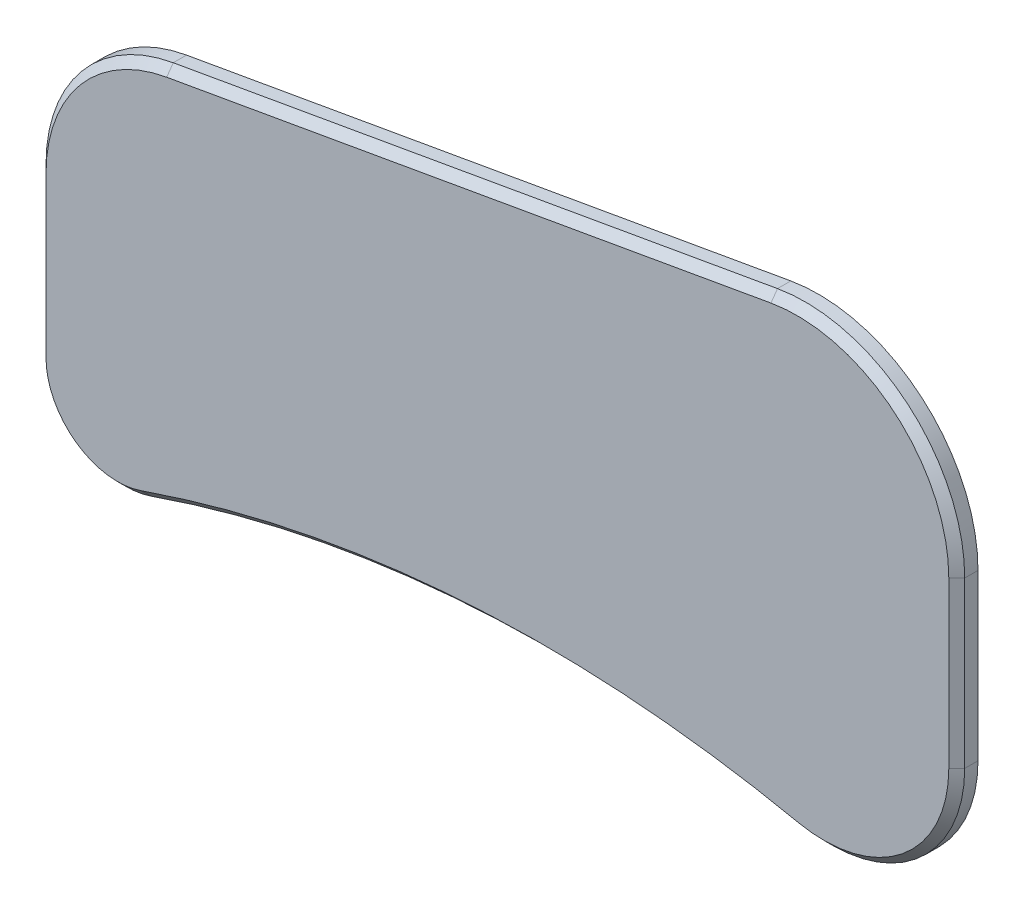
ISO-10303-21;
HEADER;
FILE_DESCRIPTION(('STEP AP214'),'2;1');
FILE_NAME('part.step','',(''),(''),'','','');
FILE_SCHEMA(('AUTOMOTIVE_DESIGN { 1 0 10303 214 1 1 1 1 }'));
ENDSEC;
DATA;
#1=APPLICATION_CONTEXT('core data for automotive mechanical design processes');
#2=APPLICATION_PROTOCOL_DEFINITION('international standard','automotive_design',2000,#1);
#3=PRODUCT_CONTEXT('',#1,'mechanical');
#4=PRODUCT('Part','Part','',(#3));
#5=PRODUCT_RELATED_PRODUCT_CATEGORY('part','',(#4));
#6=PRODUCT_DEFINITION_FORMATION('','',#4);
#7=PRODUCT_DEFINITION_CONTEXT('part definition',#1,'design');
#8=PRODUCT_DEFINITION('design','',#6,#7);
#9=PRODUCT_DEFINITION_SHAPE('','',#8);
#10=(LENGTH_UNIT() NAMED_UNIT(*) SI_UNIT(.MILLI.,.METRE.));
#11=(NAMED_UNIT(*) PLANE_ANGLE_UNIT() SI_UNIT($,.RADIAN.));
#12=(NAMED_UNIT(*) SI_UNIT($,.STERADIAN.) SOLID_ANGLE_UNIT());
#13=UNCERTAINTY_MEASURE_WITH_UNIT(LENGTH_MEASURE(1.E-05),#10,'distance_accuracy_value','');
#14=(GEOMETRIC_REPRESENTATION_CONTEXT(3) GLOBAL_UNCERTAINTY_ASSIGNED_CONTEXT((#13)) GLOBAL_UNIT_ASSIGNED_CONTEXT((#10,
#11,#12)) REPRESENTATION_CONTEXT('',''));
#15=CARTESIAN_POINT('',(0.,0.,0.));
#16=DIRECTION('',(0.,0.,1.));
#17=DIRECTION('',(1.,0.,0.));
#18=AXIS2_PLACEMENT_3D('',#15,#16,#17);
#19=CARTESIAN_POINT('',(59.9643086686465,10.5216569582568,4.));
#20=DIRECTION('',(0.,0.,-1.));
#21=DIRECTION('',(-1.,0.,0.));
#22=AXIS2_PLACEMENT_3D('',#19,#20,#21);
#23=CYLINDRICAL_SURFACE('',#22,30.0356913313535);
#24=DIRECTION('',(0.,0.,-1.));
#25=VECTOR('',#24,1.);
#26=CARTESIAN_POINT('',(54.7486656039907,40.1010386484553,4.));
#27=LINE('',#26,#25);
#28=CARTESIAN_POINT('',(54.7486656039907,40.1010386484553,2.49999999999997));
#29=VERTEX_POINT('',#28);
#30=CARTESIAN_POINT('',(54.7486656039907,40.1010386484553,0.));
#31=VERTEX_POINT('',#30);
#32=EDGE_CURVE('E124',#29,#31,#27,.T.);
#33=ORIENTED_EDGE('',*,*,#32,.F.);
#34=CARTESIAN_POINT('',(59.9643086686465,10.5216569582568,2.49999999999997));
#35=DIRECTION('',(0.,0.,1.));
#36=DIRECTION('',(1.,0.,0.));
#37=AXIS2_PLACEMENT_3D('',#34,#35,#36);
#38=CIRCLE('',#37,30.0356913313535);
#39=CARTESIAN_POINT('',(90.,10.5216569582568,2.49999999999997));
#40=VERTEX_POINT('',#39);
#41=EDGE_CURVE('E213',#29,#40,#38,.F.);
#42=ORIENTED_EDGE('',*,*,#41,.T.);
#43=DIRECTION('',(0.,0.,-1.));
#44=VECTOR('',#43,1.);
#45=CARTESIAN_POINT('',(90.,10.5216569582568,4.));
#46=LINE('',#45,#44);
#47=CARTESIAN_POINT('',(90.,10.5216569582568,0.));
#48=VERTEX_POINT('',#47);
#49=EDGE_CURVE('E146',#40,#48,#46,.T.);
#50=ORIENTED_EDGE('',*,*,#49,.T.);
#51=CARTESIAN_POINT('',(59.9643086686465,10.5216569582568,0.));
#52=DIRECTION('',(0.,0.,1.));
#53=DIRECTION('',(1.,0.,0.));
#54=AXIS2_PLACEMENT_3D('',#51,#52,#53);
#55=CIRCLE('',#54,30.0356913313535);
#56=EDGE_CURVE('E139',#48,#31,#55,.T.);
#57=ORIENTED_EDGE('',*,*,#56,.T.);
#58=EDGE_LOOP('',(#33,#42,#50,#57));
#59=FACE_BOUND('',#58,.T.);
#60=ADVANCED_FACE('F36',(#59),#23,.T.);
#61=CARTESIAN_POINT('',(54.7486656039907,40.1010386484553,4.));
#62=DIRECTION('',(0.173648177666925,-0.984807753012209,0.));
#63=DIRECTION('',(0.984807753012209,0.173648177666925,0.));
#64=AXIS2_PLACEMENT_3D('',#61,#62,#63);
#65=PLANE('',#64);
#66=DIRECTION('',(0.,0.,-1.));
#67=VECTOR('',#66,1.);
#68=CARTESIAN_POINT('',(-59.0357971523408,20.0377678790973,4.));
#69=LINE('',#68,#67);
#70=CARTESIAN_POINT('',(-59.0357971523408,20.0377678790973,2.49999999999997));
#71=VERTEX_POINT('',#70);
#72=CARTESIAN_POINT('',(-59.0357971523408,20.0377678790973,0.));
#73=VERTEX_POINT('',#72);
#74=EDGE_CURVE('E133',#71,#73,#69,.T.);
#75=ORIENTED_EDGE('',*,*,#74,.F.);
#76=DIRECTION('',(0.984807753012209,0.173648177666925,0.));
#77=VECTOR('',#76,1.);
#78=CARTESIAN_POINT('',(54.7486656039907,40.1010386484553,2.49999999999997));
#79=LINE('',#78,#77);
#80=EDGE_CURVE('E11',#71,#29,#79,.T.);
#81=ORIENTED_EDGE('',*,*,#80,.T.);
#82=ORIENTED_EDGE('',*,*,#32,.T.);
#83=DIRECTION('',(-0.984807753012209,-0.173648177666925,0.));
#84=VECTOR('',#83,1.);
#85=CARTESIAN_POINT('',(54.7486656039907,40.1010386484553,0.));
#86=LINE('',#85,#84);
#87=EDGE_CURVE('E127',#31,#73,#86,.T.);
#88=ORIENTED_EDGE('',*,*,#87,.T.);
#89=EDGE_LOOP('',(#75,#81,#82,#88));
#90=FACE_BOUND('',#89,.T.);
#91=ADVANCED_FACE('F126',(#90),#65,.F.);
#92=CARTESIAN_POINT('',(-54.,-8.52165695825679,4.));
#93=DIRECTION('',(0.,0.,-1.));
#94=DIRECTION('',(-1.,0.,0.));
#95=AXIS2_PLACEMENT_3D('',#92,#93,#94);
#96=CYLINDRICAL_SURFACE('',#95,29.);
#97=DIRECTION('',(0.,0.,-1.));
#98=VECTOR('',#97,1.);
#99=CARTESIAN_POINT('',(-83.,-8.52165695825678,4.));
#100=LINE('',#99,#98);
#101=CARTESIAN_POINT('',(-83.,-8.52165695825678,2.49999999999997));
#102=VERTEX_POINT('',#101);
#103=CARTESIAN_POINT('',(-83.,-8.52165695825678,0.));
#104=VERTEX_POINT('',#103);
#105=EDGE_CURVE('E180',#102,#104,#100,.T.);
#106=ORIENTED_EDGE('',*,*,#105,.F.);
#107=CARTESIAN_POINT('',(-54.,-8.52165695825679,2.49999999999997));
#108=DIRECTION('',(0.,0.,1.));
#109=DIRECTION('',(1.,0.,0.));
#110=AXIS2_PLACEMENT_3D('',#107,#108,#109);
#111=CIRCLE('',#110,29.);
#112=EDGE_CURVE('E46',#102,#71,#111,.F.);
#113=ORIENTED_EDGE('',*,*,#112,.T.);
#114=ORIENTED_EDGE('',*,*,#74,.T.);
#115=CARTESIAN_POINT('',(-54.,-8.52165695825679,0.));
#116=DIRECTION('',(0.,0.,1.));
#117=DIRECTION('',(1.,0.,0.));
#118=AXIS2_PLACEMENT_3D('',#115,#116,#117);
#119=CIRCLE('',#118,29.);
#120=EDGE_CURVE('E142',#73,#104,#119,.T.);
#121=ORIENTED_EDGE('',*,*,#120,.T.);
#122=EDGE_LOOP('',(#106,#113,#114,#121));
#123=FACE_BOUND('',#122,.T.);
#124=ADVANCED_FACE('F296',(#123),#96,.T.);
#125=CARTESIAN_POINT('',(-83.,-8.52165695825678,4.));
#126=DIRECTION('',(1.,0.,0.));
#127=DIRECTION('',(0.,0.,-1.));
#128=AXIS2_PLACEMENT_3D('',#125,#126,#127);
#129=PLANE('',#128);
#130=DIRECTION('',(0.,0.,-1.));
#131=VECTOR('',#130,1.);
#132=CARTESIAN_POINT('',(-83.,-38.5216569582568,4.));
#133=LINE('',#132,#131);
#134=CARTESIAN_POINT('',(-83.,-38.5216569582568,2.49999999999997));
#135=VERTEX_POINT('',#134);
#136=CARTESIAN_POINT('',(-83.,-38.5216569582568,0.));
#137=VERTEX_POINT('',#136);
#138=EDGE_CURVE('E178',#135,#137,#133,.T.);
#139=ORIENTED_EDGE('',*,*,#138,.F.);
#140=DIRECTION('',(0.,1.,0.));
#141=VECTOR('',#140,1.);
#142=CARTESIAN_POINT('',(-83.,-8.52165695825678,2.49999999999997));
#143=LINE('',#142,#141);
#144=EDGE_CURVE('E211',#135,#102,#143,.T.);
#145=ORIENTED_EDGE('',*,*,#144,.T.);
#146=ORIENTED_EDGE('',*,*,#105,.T.);
#147=DIRECTION('',(0.,-1.,0.));
#148=VECTOR('',#147,1.);
#149=CARTESIAN_POINT('',(-83.,-8.52165695825678,0.));
#150=LINE('',#149,#148);
#151=EDGE_CURVE('E156',#104,#137,#150,.T.);
#152=ORIENTED_EDGE('',*,*,#151,.T.);
#153=EDGE_LOOP('',(#139,#145,#146,#152));
#154=FACE_BOUND('',#153,.T.);
#155=ADVANCED_FACE('F278',(#154),#129,.F.);
#156=CARTESIAN_POINT('',(-68.,-38.5216569582568,4.));
#157=DIRECTION('',(0.,0.,-1.));
#158=DIRECTION('',(-1.,0.,0.));
#159=AXIS2_PLACEMENT_3D('',#156,#157,#158);
#160=CYLINDRICAL_SURFACE('',#159,15.);
#161=DIRECTION('',(0.,0.,-1.));
#162=VECTOR('',#161,1.);
#163=CARTESIAN_POINT('',(-63.0867497743949,-52.6941645776088,4.));
#164=LINE('',#163,#162);
#165=CARTESIAN_POINT('',(-63.0867497743949,-52.6941645776088,2.49999999999997));
#166=VERTEX_POINT('',#165);
#167=CARTESIAN_POINT('',(-63.0867497743949,-52.6941645776088,0.));
#168=VERTEX_POINT('',#167);
#169=EDGE_CURVE('E176',#166,#168,#164,.T.);
#170=ORIENTED_EDGE('',*,*,#169,.F.);
#171=CARTESIAN_POINT('',(-68.,-38.5216569582568,2.49999999999997));
#172=DIRECTION('',(0.,0.,1.));
#173=DIRECTION('',(1.,0.,0.));
#174=AXIS2_PLACEMENT_3D('',#171,#172,#173);
#175=CIRCLE('',#174,15.);
#176=EDGE_CURVE('E207',#166,#135,#175,.F.);
#177=ORIENTED_EDGE('',*,*,#176,.T.);
#178=ORIENTED_EDGE('',*,*,#138,.T.);
#179=CARTESIAN_POINT('',(-68.,-38.5216569582568,0.));
#180=DIRECTION('',(0.,0.,1.));
#181=DIRECTION('',(1.,0.,0.));
#182=AXIS2_PLACEMENT_3D('',#179,#180,#181);
#183=CIRCLE('',#182,15.);
#184=EDGE_CURVE('E159',#137,#168,#183,.T.);
#185=ORIENTED_EDGE('',*,*,#184,.T.);
#186=EDGE_LOOP('',(#170,#177,#178,#185));
#187=FACE_BOUND('',#186,.T.);
#188=ADVANCED_FACE('F275',(#187),#160,.T.);
#189=CARTESIAN_POINT('',(12.2497536848834,-270.00594807434,4.));
#190=DIRECTION('',(0.,0.,-1.));
#191=DIRECTION('',(-1.,0.,0.));
#192=AXIS2_PLACEMENT_3D('',#189,#190,#191);
#193=CYLINDRICAL_SURFACE('',#192,230.);
#194=DIRECTION('',(0.,0.,-1.));
#195=VECTOR('',#194,1.);
#196=CARTESIAN_POINT('',(59.8284072240082,-44.9809011853238,4.));
#197=LINE('',#196,#195);
#198=CARTESIAN_POINT('',(59.8284072240082,-44.9809011853238,2.49999999999997));
#199=VERTEX_POINT('',#198);
#200=CARTESIAN_POINT('',(59.8284072240082,-44.9809011853238,0.));
#201=VERTEX_POINT('',#200);
#202=EDGE_CURVE('E174',#199,#201,#197,.T.);
#203=ORIENTED_EDGE('',*,*,#202,.F.);
#204=CARTESIAN_POINT('',(12.2497536848834,-270.00594807434,2.49999999999997));
#205=DIRECTION('',(0.,0.,1.));
#206=DIRECTION('',(1.,0.,0.));
#207=AXIS2_PLACEMENT_3D('',#204,#205,#206);
#208=CIRCLE('',#207,230.);
#209=EDGE_CURVE('E201',#199,#166,#208,.T.);
#210=ORIENTED_EDGE('',*,*,#209,.T.);
#211=ORIENTED_EDGE('',*,*,#169,.T.);
#212=CARTESIAN_POINT('',(12.2497536848834,-270.00594807434,0.));
#213=DIRECTION('',(0.,0.,-1.));
#214=DIRECTION('',(1.,0.,0.));
#215=AXIS2_PLACEMENT_3D('',#212,#213,#214);
#216=CIRCLE('',#215,230.);
#217=EDGE_CURVE('E162',#168,#201,#216,.T.);
#218=ORIENTED_EDGE('',*,*,#217,.T.);
#219=EDGE_LOOP('',(#203,#210,#211,#218));
#220=FACE_BOUND('',#219,.T.);
#221=ADVANCED_FACE('F260',(#220),#193,.F.);
#222=CARTESIAN_POINT('',(65.,-20.5216569582568,4.));
#223=DIRECTION('',(0.,0.,-1.));
#224=DIRECTION('',(-1.,0.,0.));
#225=AXIS2_PLACEMENT_3D('',#222,#223,#224);
#226=CYLINDRICAL_SURFACE('',#225,25.);
#227=DIRECTION('',(0.,0.,-1.));
#228=VECTOR('',#227,1.);
#229=CARTESIAN_POINT('',(90.,-20.5216569582568,4.));
#230=LINE('',#229,#228);
#231=CARTESIAN_POINT('',(90.,-20.5216569582568,2.49999999999997));
#232=VERTEX_POINT('',#231);
#233=CARTESIAN_POINT('',(90.,-20.5216569582568,0.));
#234=VERTEX_POINT('',#233);
#235=EDGE_CURVE('E172',#232,#234,#230,.T.);
#236=ORIENTED_EDGE('',*,*,#235,.F.);
#237=CARTESIAN_POINT('',(65.,-20.5216569582568,2.49999999999997));
#238=DIRECTION('',(0.,0.,1.));
#239=DIRECTION('',(1.,0.,0.));
#240=AXIS2_PLACEMENT_3D('',#237,#238,#239);
#241=CIRCLE('',#240,25.);
#242=EDGE_CURVE('E205',#232,#199,#241,.F.);
#243=ORIENTED_EDGE('',*,*,#242,.T.);
#244=ORIENTED_EDGE('',*,*,#202,.T.);
#245=CARTESIAN_POINT('',(65.,-20.5216569582568,0.));
#246=DIRECTION('',(0.,0.,1.));
#247=DIRECTION('',(1.,0.,0.));
#248=AXIS2_PLACEMENT_3D('',#245,#246,#247);
#249=CIRCLE('',#248,25.);
#250=EDGE_CURVE('E166',#201,#234,#249,.T.);
#251=ORIENTED_EDGE('',*,*,#250,.T.);
#252=EDGE_LOOP('',(#236,#243,#244,#251));
#253=FACE_BOUND('',#252,.T.);
#254=ADVANCED_FACE('F257',(#253),#226,.T.);
#255=CARTESIAN_POINT('',(90.,-20.5216569582568,4.));
#256=DIRECTION('',(-1.,0.,0.));
#257=DIRECTION('',(0.,-1.,0.));
#258=AXIS2_PLACEMENT_3D('',#255,#256,#257);
#259=PLANE('',#258);
#260=ORIENTED_EDGE('',*,*,#49,.F.);
#261=DIRECTION('',(0.,-1.,0.));
#262=VECTOR('',#261,1.);
#263=CARTESIAN_POINT('',(90.,-20.5216569582568,2.49999999999997));
#264=LINE('',#263,#262);
#265=EDGE_CURVE('E209',#40,#232,#264,.T.);
#266=ORIENTED_EDGE('',*,*,#265,.T.);
#267=ORIENTED_EDGE('',*,*,#235,.T.);
#268=DIRECTION('',(0.,1.,0.));
#269=VECTOR('',#268,1.);
#270=CARTESIAN_POINT('',(90.,-20.5216569582568,0.));
#271=LINE('',#270,#269);
#272=EDGE_CURVE('E169',#234,#48,#271,.T.);
#273=ORIENTED_EDGE('',*,*,#272,.T.);
#274=EDGE_LOOP('',(#260,#266,#267,#273));
#275=FACE_BOUND('',#274,.T.);
#276=ADVANCED_FACE('F360',(#275),#259,.F.);
#277=CARTESIAN_POINT('',(59.9643086686465,10.5216569582568,4.));
#278=DIRECTION('',(0.,0.,1.));
#279=DIRECTION('',(1.,0.,0.));
#280=AXIS2_PLACEMENT_3D('',#277,#278,#279);
#281=PLANE('',#280);
#282=CARTESIAN_POINT('',(-68.,-38.5216569582568,4.));
#283=DIRECTION('',(0.,0.,1.));
#284=DIRECTION('',(1.,0.,0.));
#285=AXIS2_PLACEMENT_3D('',#282,#283,#284);
#286=CIRCLE('',#285,13.5);
#287=CARTESIAN_POINT('',(-81.5,-38.5216569582568,4.));
#288=VERTEX_POINT('',#287);
#289=CARTESIAN_POINT('',(-63.5780747969554,-51.2769138156736,4.));
#290=VERTEX_POINT('',#289);
#291=EDGE_CURVE('E193',#288,#290,#286,.T.);
#292=ORIENTED_EDGE('',*,*,#291,.T.);
#293=CARTESIAN_POINT('',(12.2497536848834,-270.00594807434,4.));
#294=DIRECTION('',(0.,0.,1.));
#295=DIRECTION('',(1.,0.,0.));
#296=AXIS2_PLACEMENT_3D('',#293,#294,#295);
#297=CIRCLE('',#296,231.5);
#298=CARTESIAN_POINT('',(60.1387027905677,-43.5133465316998,4.));
#299=VERTEX_POINT('',#298);
#300=EDGE_CURVE('E197',#290,#299,#297,.F.);
#301=ORIENTED_EDGE('',*,*,#300,.T.);
#302=CARTESIAN_POINT('',(65.,-20.5216569582568,4.));
#303=DIRECTION('',(0.,0.,1.));
#304=DIRECTION('',(1.,0.,0.));
#305=AXIS2_PLACEMENT_3D('',#302,#303,#304);
#306=CIRCLE('',#305,23.5);
#307=CARTESIAN_POINT('',(88.5,-20.5216569582568,4.));
#308=VERTEX_POINT('',#307);
#309=EDGE_CURVE('E195',#299,#308,#306,.T.);
#310=ORIENTED_EDGE('',*,*,#309,.T.);
#311=DIRECTION('',(0.,1.,0.));
#312=VECTOR('',#311,1.);
#313=CARTESIAN_POINT('',(88.5,10.5216569582568,4.));
#314=LINE('',#313,#312);
#315=CARTESIAN_POINT('',(88.5,10.5216569582568,4.));
#316=VERTEX_POINT('',#315);
#317=EDGE_CURVE('E191',#308,#316,#314,.T.);
#318=ORIENTED_EDGE('',*,*,#317,.T.);
#319=CARTESIAN_POINT('',(59.9643086686465,10.5216569582568,4.));
#320=DIRECTION('',(0.,0.,1.));
#321=DIRECTION('',(1.,0.,0.));
#322=AXIS2_PLACEMENT_3D('',#319,#320,#321);
#323=CIRCLE('',#322,28.5356913313535);
#324=CARTESIAN_POINT('',(55.0091378704911,38.623827018937,4.));
#325=VERTEX_POINT('',#324);
#326=EDGE_CURVE('E187',#316,#325,#323,.T.);
#327=ORIENTED_EDGE('',*,*,#326,.T.);
#328=DIRECTION('',(-0.984807753012209,-0.173648177666925,0.));
#329=VECTOR('',#328,1.);
#330=CARTESIAN_POINT('',(-58.7753248858404,18.5605562495789,4.));
#331=LINE('',#330,#329);
#332=CARTESIAN_POINT('',(-58.7753248858404,18.5605562495789,4.));
#333=VERTEX_POINT('',#332);
#334=EDGE_CURVE('E132',#325,#333,#331,.T.);
#335=ORIENTED_EDGE('',*,*,#334,.T.);
#336=CARTESIAN_POINT('',(-54.,-8.52165695825679,4.));
#337=DIRECTION('',(0.,0.,1.));
#338=DIRECTION('',(1.,0.,0.));
#339=AXIS2_PLACEMENT_3D('',#336,#337,#338);
#340=CIRCLE('',#339,27.5);
#341=CARTESIAN_POINT('',(-81.5,-8.52165695825678,4.));
#342=VERTEX_POINT('',#341);
#343=EDGE_CURVE('E185',#333,#342,#340,.T.);
#344=ORIENTED_EDGE('',*,*,#343,.T.);
#345=DIRECTION('',(0.,-1.,0.));
#346=VECTOR('',#345,1.);
#347=CARTESIAN_POINT('',(-81.5,-38.5216569582568,4.));
#348=LINE('',#347,#346);
#349=EDGE_CURVE('E189',#342,#288,#348,.T.);
#350=ORIENTED_EDGE('',*,*,#349,.T.);
#351=EDGE_LOOP('',(#292,#301,#310,#318,#327,#335,#344,#350));
#352=FACE_BOUND('',#351,.T.);
#353=ADVANCED_FACE('F242',(#352),#281,.T.);
#354=CARTESIAN_POINT('',(59.9643086686465,10.5216569582568,0.));
#355=DIRECTION('',(0.,0.,1.));
#356=DIRECTION('',(1.,0.,0.));
#357=AXIS2_PLACEMENT_3D('',#354,#355,#356);
#358=PLANE('',#357);
#359=ORIENTED_EDGE('',*,*,#56,.F.);
#360=ORIENTED_EDGE('',*,*,#272,.F.);
#361=ORIENTED_EDGE('',*,*,#250,.F.);
#362=ORIENTED_EDGE('',*,*,#217,.F.);
#363=ORIENTED_EDGE('',*,*,#184,.F.);
#364=ORIENTED_EDGE('',*,*,#151,.F.);
#365=ORIENTED_EDGE('',*,*,#120,.F.);
#366=ORIENTED_EDGE('',*,*,#87,.F.);
#367=EDGE_LOOP('',(#359,#360,#361,#362,#363,#364,#365,#366));
#368=FACE_BOUND('',#367,.T.);
#369=ADVANCED_FACE('F137',(#368),#358,.F.);
#370=CARTESIAN_POINT('',(55.0091378704911,38.623827018937,4.));
#371=DIRECTION('',(-0.122787803968969,0.696364240320022,0.707106781186545));
#372=DIRECTION('',(0.984807753012209,0.173648177666925,0.));
#373=AXIS2_PLACEMENT_3D('',#370,#371,#372);
#374=PLANE('',#373);
#375=DIRECTION('',(0.122787803968968,-0.696364240320017,0.70710678118655));
#376=VECTOR('',#375,1.);
#377=CARTESIAN_POINT('',(54.7486656039907,40.1010386484553,2.49999999999997));
#378=LINE('',#377,#376);
#379=EDGE_CURVE('E153',#29,#325,#378,.T.);
#380=ORIENTED_EDGE('',*,*,#379,.F.);
#381=ORIENTED_EDGE('',*,*,#80,.F.);
#382=DIRECTION('',(-0.122787803968968,0.696364240320018,-0.707106781186549));
#383=VECTOR('',#382,1.);
#384=CARTESIAN_POINT('',(-58.7753248858404,18.5605562495789,4.));
#385=LINE('',#384,#383);
#386=EDGE_CURVE('E40',#333,#71,#385,.T.);
#387=ORIENTED_EDGE('',*,*,#386,.F.);
#388=ORIENTED_EDGE('',*,*,#334,.F.);
#389=EDGE_LOOP('',(#380,#381,#387,#388));
#390=FACE_BOUND('',#389,.T.);
#391=ADVANCED_FACE('F38',(#390),#374,.T.);
#392=CARTESIAN_POINT('',(-54.,-8.52165695825679,4.));
#393=DIRECTION('',(0.,0.,-1.));
#394=DIRECTION('',(-1.,0.,0.));
#395=AXIS2_PLACEMENT_3D('',#392,#393,#394);
#396=CONICAL_SURFACE('',#395,27.5,0.785398163397444);
#397=ORIENTED_EDGE('',*,*,#386,.T.);
#398=ORIENTED_EDGE('',*,*,#112,.F.);
#399=DIRECTION('',(-0.707106781186544,0.,-0.707106781186551));
#400=VECTOR('',#399,1.);
#401=CARTESIAN_POINT('',(-81.5,-8.52165695825678,4.));
#402=LINE('',#401,#400);
#403=EDGE_CURVE('E229',#342,#102,#402,.T.);
#404=ORIENTED_EDGE('',*,*,#403,.F.);
#405=ORIENTED_EDGE('',*,*,#343,.F.);
#406=EDGE_LOOP('',(#397,#398,#404,#405));
#407=FACE_BOUND('',#406,.T.);
#408=ADVANCED_FACE('F284',(#407),#396,.T.);
#409=CARTESIAN_POINT('',(59.9643086686465,10.5216569582568,4.));
#410=DIRECTION('',(0.,0.,-1.));
#411=DIRECTION('',(-1.,0.,0.));
#412=AXIS2_PLACEMENT_3D('',#409,#410,#411);
#413=CONICAL_SURFACE('',#412,28.5356913313535,0.785398163397444);
#414=ORIENTED_EDGE('',*,*,#379,.T.);
#415=ORIENTED_EDGE('',*,*,#326,.F.);
#416=DIRECTION('',(-0.707106781186544,0.,0.707106781186551));
#417=VECTOR('',#416,1.);
#418=CARTESIAN_POINT('',(90.,10.5216569582568,2.49999999999997));
#419=LINE('',#418,#417);
#420=EDGE_CURVE('E226',#40,#316,#419,.T.);
#421=ORIENTED_EDGE('',*,*,#420,.F.);
#422=ORIENTED_EDGE('',*,*,#41,.F.);
#423=EDGE_LOOP('',(#414,#415,#421,#422));
#424=FACE_BOUND('',#423,.T.);
#425=ADVANCED_FACE('F235',(#424),#413,.T.);
#426=CARTESIAN_POINT('',(-81.5,10.5216569582568,4.));
#427=DIRECTION('',(-0.707106781186551,0.,0.707106781186544));
#428=DIRECTION('',(0.,1.,0.));
#429=AXIS2_PLACEMENT_3D('',#426,#427,#428);
#430=PLANE('',#429);
#431=ORIENTED_EDGE('',*,*,#403,.T.);
#432=ORIENTED_EDGE('',*,*,#144,.F.);
#433=DIRECTION('',(-0.707106781186544,0.,-0.707106781186551));
#434=VECTOR('',#433,1.);
#435=CARTESIAN_POINT('',(-81.5,-38.5216569582568,4.));
#436=LINE('',#435,#434);
#437=EDGE_CURVE('E223',#288,#135,#436,.T.);
#438=ORIENTED_EDGE('',*,*,#437,.F.);
#439=ORIENTED_EDGE('',*,*,#349,.F.);
#440=EDGE_LOOP('',(#431,#432,#438,#439));
#441=FACE_BOUND('',#440,.T.);
#442=ADVANCED_FACE('F281',(#441),#430,.T.);
#443=CARTESIAN_POINT('',(88.5,10.5216569582568,4.));
#444=DIRECTION('',(0.707106781186551,0.,0.707106781186544));
#445=DIRECTION('',(0.,-1.,0.));
#446=AXIS2_PLACEMENT_3D('',#443,#444,#445);
#447=PLANE('',#446);
#448=ORIENTED_EDGE('',*,*,#420,.T.);
#449=ORIENTED_EDGE('',*,*,#317,.F.);
#450=DIRECTION('',(-0.707106781186544,0.,0.707106781186551));
#451=VECTOR('',#450,1.);
#452=CARTESIAN_POINT('',(90.,-20.5216569582568,2.49999999999997));
#453=LINE('',#452,#451);
#454=EDGE_CURVE('E220',#232,#308,#453,.T.);
#455=ORIENTED_EDGE('',*,*,#454,.F.);
#456=ORIENTED_EDGE('',*,*,#265,.F.);
#457=EDGE_LOOP('',(#448,#449,#455,#456));
#458=FACE_BOUND('',#457,.T.);
#459=ADVANCED_FACE('F248',(#458),#447,.T.);
#460=CARTESIAN_POINT('',(-68.,-38.5216569582568,4.));
#461=DIRECTION('',(0.,0.,-1.));
#462=DIRECTION('',(-1.,0.,0.));
#463=AXIS2_PLACEMENT_3D('',#460,#461,#462);
#464=CONICAL_SURFACE('',#463,13.5,0.785398163397444);
#465=ORIENTED_EDGE('',*,*,#437,.T.);
#466=ORIENTED_EDGE('',*,*,#176,.F.);
#467=DIRECTION('',(0.231612836812783,-0.668098416270786,-0.70710678118655));
#468=VECTOR('',#467,1.);
#469=CARTESIAN_POINT('',(-63.5780747969554,-51.2769138156736,4.));
#470=LINE('',#469,#468);
#471=EDGE_CURVE('E218',#290,#166,#470,.T.);
#472=ORIENTED_EDGE('',*,*,#471,.F.);
#473=ORIENTED_EDGE('',*,*,#291,.F.);
#474=EDGE_LOOP('',(#465,#466,#472,#473));
#475=FACE_BOUND('',#474,.T.);
#476=ADVANCED_FACE('F271',(#475),#464,.T.);
#477=CARTESIAN_POINT('',(65.,-20.5216569582568,4.));
#478=DIRECTION('',(0.,0.,-1.));
#479=DIRECTION('',(-1.,0.,0.));
#480=AXIS2_PLACEMENT_3D('',#477,#478,#479);
#481=CONICAL_SURFACE('',#480,23.5,0.785398163397446);
#482=ORIENTED_EDGE('',*,*,#454,.T.);
#483=ORIENTED_EDGE('',*,*,#309,.F.);
#484=DIRECTION('',(0.146274732857568,0.691811898226275,0.707106781186551));
#485=VECTOR('',#484,1.);
#486=CARTESIAN_POINT('',(59.8284072240082,-44.9809011853238,2.49999999999997));
#487=LINE('',#486,#485);
#488=EDGE_CURVE('E216',#199,#299,#487,.T.);
#489=ORIENTED_EDGE('',*,*,#488,.F.);
#490=ORIENTED_EDGE('',*,*,#242,.F.);
#491=EDGE_LOOP('',(#482,#483,#489,#490));
#492=FACE_BOUND('',#491,.T.);
#493=ADVANCED_FACE('F252',(#492),#481,.T.);
#494=CARTESIAN_POINT('',(12.2497536848834,-270.00594807434,4.));
#495=DIRECTION('',(0.,0.,1.));
#496=DIRECTION('',(1.,0.,0.));
#497=AXIS2_PLACEMENT_3D('',#494,#495,#496);
#498=CONICAL_SURFACE('',#497,231.5,0.785398163397439);
#499=ORIENTED_EDGE('',*,*,#471,.T.);
#500=ORIENTED_EDGE('',*,*,#209,.F.);
#501=ORIENTED_EDGE('',*,*,#488,.T.);
#502=ORIENTED_EDGE('',*,*,#300,.F.);
#503=EDGE_LOOP('',(#499,#500,#501,#502));
#504=FACE_BOUND('',#503,.T.);
#505=ADVANCED_FACE('F265',(#504),#498,.F.);
#506=CLOSED_SHELL('',(#60,#91,#124,#155,#188,#221,#254,#276,#353,#369,#391,#408,#425,#442,#459,
#476,#493,#505));
#507=MANIFOLD_SOLID_BREP('B2',#506);
#508=ADVANCED_BREP_SHAPE_REPRESENTATION('',(#18,#507),#14);
#509=SHAPE_DEFINITION_REPRESENTATION(#9,#508);
ENDSEC;
END-ISO-10303-21;
